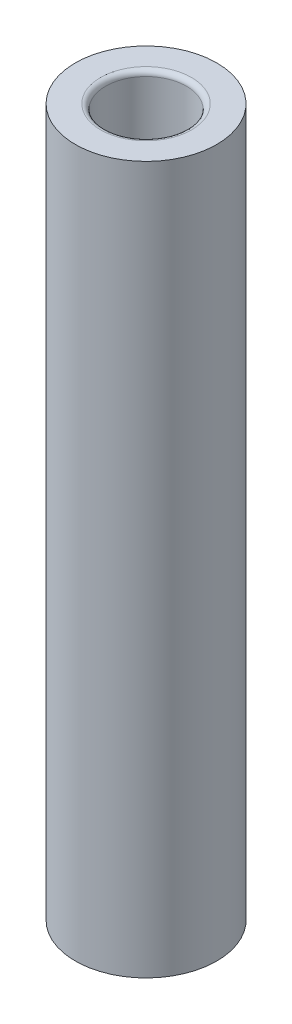
ISO-10303-21;
HEADER;
FILE_DESCRIPTION(('STEP AP214'),'2;1');
FILE_NAME('part.step','',(''),(''),'','','');
FILE_SCHEMA(('AUTOMOTIVE_DESIGN { 1 0 10303 214 1 1 1 1 }'));
ENDSEC;
DATA;
#1=APPLICATION_CONTEXT('core data for automotive mechanical design processes');
#2=APPLICATION_PROTOCOL_DEFINITION('international standard','automotive_design',2000,#1);
#3=PRODUCT_CONTEXT('',#1,'mechanical');
#4=PRODUCT('Part','Part','',(#3));
#5=PRODUCT_RELATED_PRODUCT_CATEGORY('part','',(#4));
#6=PRODUCT_DEFINITION_FORMATION('','',#4);
#7=PRODUCT_DEFINITION_CONTEXT('part definition',#1,'design');
#8=PRODUCT_DEFINITION('design','',#6,#7);
#9=PRODUCT_DEFINITION_SHAPE('','',#8);
#10=(LENGTH_UNIT() NAMED_UNIT(*) SI_UNIT(.MILLI.,.METRE.));
#11=(NAMED_UNIT(*) PLANE_ANGLE_UNIT() SI_UNIT($,.RADIAN.));
#12=(NAMED_UNIT(*) SI_UNIT($,.STERADIAN.) SOLID_ANGLE_UNIT());
#13=UNCERTAINTY_MEASURE_WITH_UNIT(LENGTH_MEASURE(1.E-05),#10,'distance_accuracy_value','');
#14=(GEOMETRIC_REPRESENTATION_CONTEXT(3) GLOBAL_UNCERTAINTY_ASSIGNED_CONTEXT((#13)) GLOBAL_UNIT_ASSIGNED_CONTEXT((#10,
#11,#12)) REPRESENTATION_CONTEXT('',''));
#15=CARTESIAN_POINT('',(0.,0.,0.));
#16=DIRECTION('',(0.,0.,1.));
#17=DIRECTION('',(1.,0.,0.));
#18=AXIS2_PLACEMENT_3D('',#15,#16,#17);
#19=CARTESIAN_POINT('',(0.,35.,0.));
#20=DIRECTION('',(0.,-1.,0.));
#21=DIRECTION('',(0.,0.,-1.));
#22=AXIS2_PLACEMENT_3D('',#19,#20,#21);
#23=CYLINDRICAL_SURFACE('',#22,2.);
#24=CARTESIAN_POINT('',(0.,34.75,0.));
#25=DIRECTION('',(0.,1.,0.));
#26=DIRECTION('',(0.,0.,1.));
#27=AXIS2_PLACEMENT_3D('',#24,#25,#26);
#28=CIRCLE('',#27,2.);
#29=CARTESIAN_POINT('',(0.,34.75,2.));
#30=VERTEX_POINT('',#29);
#31=EDGE_CURVE('E115',#30,#30,#28,.F.);
#32=ORIENTED_EDGE('',*,*,#31,.F.);
#33=EDGE_LOOP('',(#32));
#34=FACE_BOUND('',#33,.T.);
#35=CARTESIAN_POINT('',(0.,0.25,0.));
#36=DIRECTION('',(0.,1.,0.));
#37=DIRECTION('',(0.,0.,1.));
#38=AXIS2_PLACEMENT_3D('',#35,#36,#37);
#39=CIRCLE('',#38,2.);
#40=CARTESIAN_POINT('',(0.,0.25,2.));
#41=VERTEX_POINT('',#40);
#42=EDGE_CURVE('E55',#41,#41,#39,.T.);
#43=ORIENTED_EDGE('',*,*,#42,.F.);
#44=EDGE_LOOP('',(#43));
#45=FACE_BOUND('',#44,.T.);
#46=ADVANCED_FACE('F17',(#34,#45),#23,.F.);
#47=CARTESIAN_POINT('',(0.,34.75,0.));
#48=DIRECTION('',(0.,1.,0.));
#49=DIRECTION('',(0.,0.,1.));
#50=AXIS2_PLACEMENT_3D('',#47,#48,#49);
#51=TOROIDAL_SURFACE('',#50,2.25,0.25);
#52=ORIENTED_EDGE('',*,*,#31,.T.);
#53=EDGE_LOOP('',(#52));
#54=FACE_BOUND('',#53,.T.);
#55=CARTESIAN_POINT('',(0.,35.,0.));
#56=DIRECTION('',(0.,1.,0.));
#57=DIRECTION('',(0.,0.,1.));
#58=AXIS2_PLACEMENT_3D('',#55,#56,#57);
#59=CIRCLE('',#58,2.25);
#60=CARTESIAN_POINT('',(0.,35.,-2.25));
#61=VERTEX_POINT('',#60);
#62=CARTESIAN_POINT('',(0.,35.,2.25));
#63=VERTEX_POINT('',#62);
#64=EDGE_CURVE('E46',#61,#63,#59,.F.);
#65=ORIENTED_EDGE('',*,*,#64,.F.);
#66=CARTESIAN_POINT('',(0.,35.,0.));
#67=DIRECTION('',(0.,1.,0.));
#68=DIRECTION('',(0.,0.,-1.));
#69=AXIS2_PLACEMENT_3D('',#66,#67,#68);
#70=CIRCLE('',#69,2.25);
#71=EDGE_CURVE('E44',#63,#61,#70,.F.);
#72=ORIENTED_EDGE('',*,*,#71,.F.);
#73=EDGE_LOOP('',(#65,#72));
#74=FACE_BOUND('',#73,.T.);
#75=ADVANCED_FACE('F48',(#54,#74),#51,.T.);
#76=CARTESIAN_POINT('',(0.,0.25,0.));
#77=DIRECTION('',(0.,1.,0.));
#78=DIRECTION('',(0.,0.,1.));
#79=AXIS2_PLACEMENT_3D('',#76,#77,#78);
#80=TOROIDAL_SURFACE('',#79,2.25,0.25);
#81=CARTESIAN_POINT('',(0.,0.,0.));
#82=DIRECTION('',(0.,-1.,0.));
#83=DIRECTION('',(0.,0.,1.));
#84=AXIS2_PLACEMENT_3D('',#81,#82,#83);
#85=CIRCLE('',#84,2.25);
#86=CARTESIAN_POINT('',(0.,0.,2.25));
#87=VERTEX_POINT('',#86);
#88=CARTESIAN_POINT('',(0.,0.,-2.25));
#89=VERTEX_POINT('',#88);
#90=EDGE_CURVE('E35',#87,#89,#85,.T.);
#91=ORIENTED_EDGE('',*,*,#90,.T.);
#92=CARTESIAN_POINT('',(0.,0.,0.));
#93=DIRECTION('',(0.,-1.,0.));
#94=DIRECTION('',(0.,0.,-1.));
#95=AXIS2_PLACEMENT_3D('',#92,#93,#94);
#96=CIRCLE('',#95,2.25);
#97=EDGE_CURVE('E92',#89,#87,#96,.T.);
#98=ORIENTED_EDGE('',*,*,#97,.T.);
#99=EDGE_LOOP('',(#91,#98));
#100=FACE_BOUND('',#99,.T.);
#101=ORIENTED_EDGE('',*,*,#42,.T.);
#102=EDGE_LOOP('',(#101));
#103=FACE_BOUND('',#102,.T.);
#104=ADVANCED_FACE('F75',(#100,#103),#80,.T.);
#105=CARTESIAN_POINT('',(0.,35.,0.));
#106=DIRECTION('',(0.,1.,0.));
#107=DIRECTION('',(0.,0.,1.));
#108=AXIS2_PLACEMENT_3D('',#105,#106,#107);
#109=PLANE('',#108);
#110=CARTESIAN_POINT('',(0.,35.,0.));
#111=DIRECTION('',(0.,-1.,0.));
#112=DIRECTION('',(0.,0.,-1.));
#113=AXIS2_PLACEMENT_3D('',#110,#111,#112);
#114=CIRCLE('',#113,3.5);
#115=CARTESIAN_POINT('',(0.,35.,-3.5));
#116=VERTEX_POINT('',#115);
#117=EDGE_CURVE('E27',#116,#116,#114,.T.);
#118=ORIENTED_EDGE('',*,*,#117,.F.);
#119=EDGE_LOOP('',(#118));
#120=FACE_BOUND('',#119,.T.);
#121=ORIENTED_EDGE('',*,*,#71,.T.);
#122=ORIENTED_EDGE('',*,*,#64,.T.);
#123=EDGE_LOOP('',(#121,#122));
#124=FACE_BOUND('',#123,.T.);
#125=ADVANCED_FACE('F54',(#120,#124),#109,.T.);
#126=CARTESIAN_POINT('',(0.,0.,0.));
#127=DIRECTION('',(0.,1.,0.));
#128=DIRECTION('',(0.,0.,1.));
#129=AXIS2_PLACEMENT_3D('',#126,#127,#128);
#130=PLANE('',#129);
#131=CARTESIAN_POINT('',(0.,0.,0.));
#132=DIRECTION('',(0.,-1.,0.));
#133=DIRECTION('',(0.,0.,-1.));
#134=AXIS2_PLACEMENT_3D('',#131,#132,#133);
#135=CIRCLE('',#134,3.5);
#136=CARTESIAN_POINT('',(0.,0.,-3.5));
#137=VERTEX_POINT('',#136);
#138=EDGE_CURVE('E10',#137,#137,#135,.F.);
#139=ORIENTED_EDGE('',*,*,#138,.F.);
#140=EDGE_LOOP('',(#139));
#141=FACE_BOUND('',#140,.T.);
#142=ORIENTED_EDGE('',*,*,#90,.F.);
#143=ORIENTED_EDGE('',*,*,#97,.F.);
#144=EDGE_LOOP('',(#142,#143));
#145=FACE_BOUND('',#144,.T.);
#146=ADVANCED_FACE('F74',(#141,#145),#130,.F.);
#147=CARTESIAN_POINT('',(0.,15.,0.));
#148=DIRECTION('',(0.,-1.,0.));
#149=DIRECTION('',(0.,0.,-1.));
#150=AXIS2_PLACEMENT_3D('',#147,#148,#149);
#151=CYLINDRICAL_SURFACE('',#150,3.5);
#152=ORIENTED_EDGE('',*,*,#138,.T.);
#153=EDGE_LOOP('',(#152));
#154=FACE_BOUND('',#153,.T.);
#155=ORIENTED_EDGE('',*,*,#117,.T.);
#156=EDGE_LOOP('',(#155));
#157=FACE_BOUND('',#156,.T.);
#158=ADVANCED_FACE('F129',(#154,#157),#151,.T.);
#159=CLOSED_SHELL('',(#46,#75,#104,#125,#146,#158));
#160=MANIFOLD_SOLID_BREP('B1',#159);
#161=ADVANCED_BREP_SHAPE_REPRESENTATION('',(#18,#160),#14);
#162=SHAPE_DEFINITION_REPRESENTATION(#9,#161);
ENDSEC;
END-ISO-10303-21;
